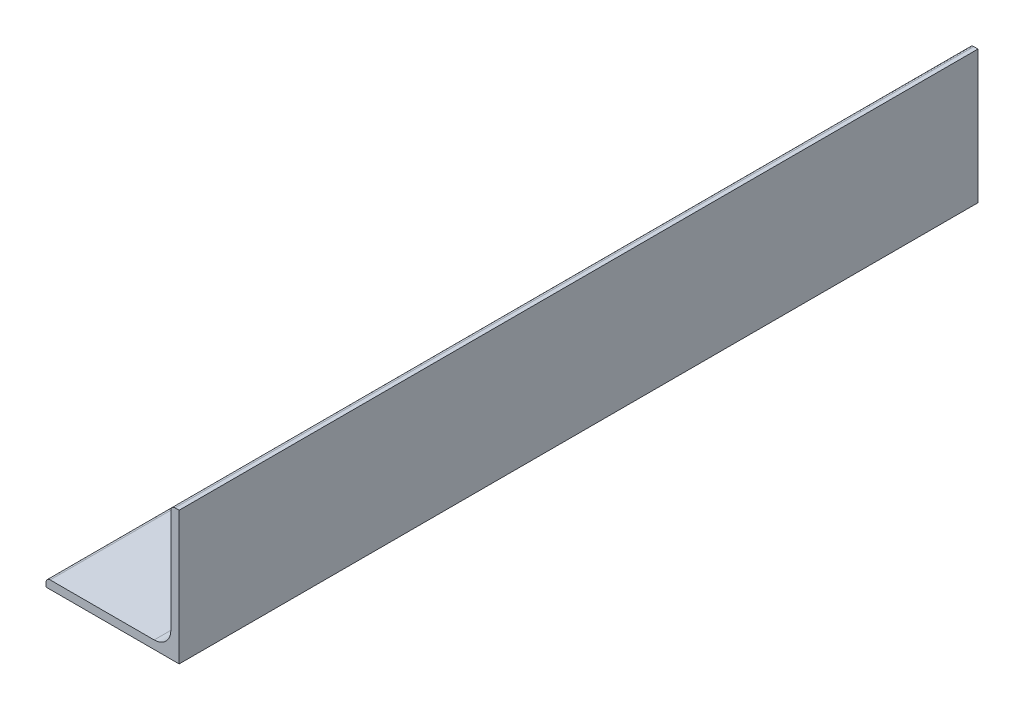
ISO-10303-21;
HEADER;
FILE_DESCRIPTION(('STEP AP214'),'2;1');
FILE_NAME('part.step','',(''),(''),'','','');
FILE_SCHEMA(('AUTOMOTIVE_DESIGN { 1 0 10303 214 1 1 1 1 }'));
ENDSEC;
DATA;
#1=APPLICATION_CONTEXT('core data for automotive mechanical design processes');
#2=APPLICATION_PROTOCOL_DEFINITION('international standard','automotive_design',2000,#1);
#3=PRODUCT_CONTEXT('',#1,'mechanical');
#4=PRODUCT('Part','Part','',(#3));
#5=PRODUCT_RELATED_PRODUCT_CATEGORY('part','',(#4));
#6=PRODUCT_DEFINITION_FORMATION('','',#4);
#7=PRODUCT_DEFINITION_CONTEXT('part definition',#1,'design');
#8=PRODUCT_DEFINITION('design','',#6,#7);
#9=PRODUCT_DEFINITION_SHAPE('','',#8);
#10=(LENGTH_UNIT() NAMED_UNIT(*) SI_UNIT(.MILLI.,.METRE.));
#11=(NAMED_UNIT(*) PLANE_ANGLE_UNIT() SI_UNIT($,.RADIAN.));
#12=(NAMED_UNIT(*) SI_UNIT($,.STERADIAN.) SOLID_ANGLE_UNIT());
#13=UNCERTAINTY_MEASURE_WITH_UNIT(LENGTH_MEASURE(1.E-05),#10,'distance_accuracy_value','');
#14=(GEOMETRIC_REPRESENTATION_CONTEXT(3) GLOBAL_UNCERTAINTY_ASSIGNED_CONTEXT((#13)) GLOBAL_UNIT_ASSIGNED_CONTEXT((#10,
#11,#12)) REPRESENTATION_CONTEXT('',''));
#15=CARTESIAN_POINT('',(0.,0.,0.));
#16=DIRECTION('',(0.,0.,1.));
#17=DIRECTION('',(1.,0.,0.));
#18=AXIS2_PLACEMENT_3D('',#15,#16,#17);
#19=CARTESIAN_POINT('',(-25.4,-23.8125,152.4));
#20=DIRECTION('',(1.,0.,0.));
#21=DIRECTION('',(0.,1.,0.));
#22=AXIS2_PLACEMENT_3D('',#19,#20,#21);
#23=PLANE('',#22);
#24=DIRECTION('',(0.,-1.,0.));
#25=VECTOR('',#24,1.);
#26=CARTESIAN_POINT('',(-25.4,-23.8125,-152.4));
#27=LINE('',#26,#25);
#28=CARTESIAN_POINT('',(-25.4,-23.8125,-152.4));
#29=VERTEX_POINT('',#28);
#30=CARTESIAN_POINT('',(-25.4,-25.4,-152.4));
#31=VERTEX_POINT('',#30);
#32=EDGE_CURVE('E136',#29,#31,#27,.T.);
#33=ORIENTED_EDGE('',*,*,#32,.T.);
#34=DIRECTION('',(0.,0.,-1.));
#35=VECTOR('',#34,1.);
#36=CARTESIAN_POINT('',(-25.4,-25.4,152.4));
#37=LINE('',#36,#35);
#38=CARTESIAN_POINT('',(-25.4,-25.4,152.4));
#39=VERTEX_POINT('',#38);
#40=EDGE_CURVE('E11',#39,#31,#37,.T.);
#41=ORIENTED_EDGE('',*,*,#40,.F.);
#42=DIRECTION('',(0.,-1.,0.));
#43=VECTOR('',#42,1.);
#44=CARTESIAN_POINT('',(-25.4,-23.8125,152.4));
#45=LINE('',#44,#43);
#46=CARTESIAN_POINT('',(-25.4,-23.8125,152.4));
#47=VERTEX_POINT('',#46);
#48=EDGE_CURVE('E152',#47,#39,#45,.T.);
#49=ORIENTED_EDGE('',*,*,#48,.F.);
#50=DIRECTION('',(0.,0.,-1.));
#51=VECTOR('',#50,1.);
#52=CARTESIAN_POINT('',(-25.4,-23.8125,152.4));
#53=LINE('',#52,#51);
#54=EDGE_CURVE('E132',#47,#29,#53,.T.);
#55=ORIENTED_EDGE('',*,*,#54,.T.);
#56=EDGE_LOOP('',(#33,#41,#49,#55));
#57=FACE_BOUND('',#56,.T.);
#58=ADVANCED_FACE('F34',(#57),#23,.F.);
#59=CARTESIAN_POINT('',(-25.4,-25.4,152.4));
#60=DIRECTION('',(0.,1.,0.));
#61=DIRECTION('',(-1.,0.,0.));
#62=AXIS2_PLACEMENT_3D('',#59,#60,#61);
#63=PLANE('',#62);
#64=DIRECTION('',(1.,0.,0.));
#65=VECTOR('',#64,1.);
#66=CARTESIAN_POINT('',(-25.4,-25.4,-152.4));
#67=LINE('',#66,#65);
#68=CARTESIAN_POINT('',(25.4,-25.4,-152.4));
#69=VERTEX_POINT('',#68);
#70=EDGE_CURVE('E139',#31,#69,#67,.T.);
#71=ORIENTED_EDGE('',*,*,#70,.T.);
#72=DIRECTION('',(0.,0.,-1.));
#73=VECTOR('',#72,1.);
#74=CARTESIAN_POINT('',(25.4,-25.4,152.4));
#75=LINE('',#74,#73);
#76=CARTESIAN_POINT('',(25.4,-25.4,152.4));
#77=VERTEX_POINT('',#76);
#78=EDGE_CURVE('E42',#77,#69,#75,.T.);
#79=ORIENTED_EDGE('',*,*,#78,.F.);
#80=DIRECTION('',(1.,0.,0.));
#81=VECTOR('',#80,1.);
#82=CARTESIAN_POINT('',(-25.4,-25.4,152.4));
#83=LINE('',#82,#81);
#84=EDGE_CURVE('E96',#39,#77,#83,.T.);
#85=ORIENTED_EDGE('',*,*,#84,.F.);
#86=ORIENTED_EDGE('',*,*,#40,.T.);
#87=EDGE_LOOP('',(#71,#79,#85,#86));
#88=FACE_BOUND('',#87,.T.);
#89=ADVANCED_FACE('F195',(#88),#63,.F.);
#90=CARTESIAN_POINT('',(25.4,-25.4,152.4));
#91=DIRECTION('',(-1.,0.,0.));
#92=DIRECTION('',(0.,-1.,0.));
#93=AXIS2_PLACEMENT_3D('',#90,#91,#92);
#94=PLANE('',#93);
#95=DIRECTION('',(0.,1.,0.));
#96=VECTOR('',#95,1.);
#97=CARTESIAN_POINT('',(25.4,-25.4,-152.4));
#98=LINE('',#97,#96);
#99=CARTESIAN_POINT('',(25.4,25.4,-152.4));
#100=VERTEX_POINT('',#99);
#101=EDGE_CURVE('E141',#69,#100,#98,.T.);
#102=ORIENTED_EDGE('',*,*,#101,.T.);
#103=DIRECTION('',(0.,0.,-1.));
#104=VECTOR('',#103,1.);
#105=CARTESIAN_POINT('',(25.4,25.4,152.4));
#106=LINE('',#105,#104);
#107=CARTESIAN_POINT('',(25.4,25.4,152.4));
#108=VERTEX_POINT('',#107);
#109=EDGE_CURVE('E162',#108,#100,#106,.T.);
#110=ORIENTED_EDGE('',*,*,#109,.F.);
#111=DIRECTION('',(0.,1.,0.));
#112=VECTOR('',#111,1.);
#113=CARTESIAN_POINT('',(25.4,-25.4,152.4));
#114=LINE('',#113,#112);
#115=EDGE_CURVE('E170',#77,#108,#114,.T.);
#116=ORIENTED_EDGE('',*,*,#115,.F.);
#117=ORIENTED_EDGE('',*,*,#78,.T.);
#118=EDGE_LOOP('',(#102,#110,#116,#117));
#119=FACE_BOUND('',#118,.T.);
#120=ADVANCED_FACE('F168',(#119),#94,.F.);
#121=CARTESIAN_POINT('',(23.8125,25.4,152.4));
#122=DIRECTION('',(0.,-1.,0.));
#123=DIRECTION('',(1.,0.,0.));
#124=AXIS2_PLACEMENT_3D('',#121,#122,#123);
#125=PLANE('',#124);
#126=DIRECTION('',(-1.,0.,0.));
#127=VECTOR('',#126,1.);
#128=CARTESIAN_POINT('',(23.8125,25.4,-152.4));
#129=LINE('',#128,#127);
#130=CARTESIAN_POINT('',(23.8125,25.4,-152.4));
#131=VERTEX_POINT('',#130);
#132=EDGE_CURVE('E143',#100,#131,#129,.T.);
#133=ORIENTED_EDGE('',*,*,#132,.T.);
#134=DIRECTION('',(0.,0.,-1.));
#135=VECTOR('',#134,1.);
#136=CARTESIAN_POINT('',(23.8125,25.4,152.4));
#137=LINE('',#136,#135);
#138=CARTESIAN_POINT('',(23.8125,25.4,152.4));
#139=VERTEX_POINT('',#138);
#140=EDGE_CURVE('E159',#139,#131,#137,.T.);
#141=ORIENTED_EDGE('',*,*,#140,.F.);
#142=DIRECTION('',(-1.,0.,0.));
#143=VECTOR('',#142,1.);
#144=CARTESIAN_POINT('',(23.8125,25.4,152.4));
#145=LINE('',#144,#143);
#146=EDGE_CURVE('E186',#108,#139,#145,.T.);
#147=ORIENTED_EDGE('',*,*,#146,.F.);
#148=ORIENTED_EDGE('',*,*,#109,.T.);
#149=EDGE_LOOP('',(#133,#141,#147,#148));
#150=FACE_BOUND('',#149,.T.);
#151=ADVANCED_FACE('F179',(#150),#125,.F.);
#152=CARTESIAN_POINT('',(23.8125,23.8125,152.4));
#153=DIRECTION('',(0.,0.,-1.));
#154=DIRECTION('',(-1.,0.,0.));
#155=AXIS2_PLACEMENT_3D('',#152,#153,#154);
#156=CYLINDRICAL_SURFACE('',#155,1.58750000000001);
#157=CARTESIAN_POINT('',(23.8125,23.8125,-152.4));
#158=DIRECTION('',(0.,0.,1.));
#159=DIRECTION('',(-1.,0.,0.));
#160=AXIS2_PLACEMENT_3D('',#157,#158,#159);
#161=CIRCLE('',#160,1.58750000000001);
#162=CARTESIAN_POINT('',(22.225,23.8125,-152.4));
#163=VERTEX_POINT('',#162);
#164=EDGE_CURVE('E145',#131,#163,#161,.T.);
#165=ORIENTED_EDGE('',*,*,#164,.T.);
#166=DIRECTION('',(0.,0.,-1.));
#167=VECTOR('',#166,1.);
#168=CARTESIAN_POINT('',(22.225,23.8125,152.4));
#169=LINE('',#168,#167);
#170=CARTESIAN_POINT('',(22.225,23.8125,152.4));
#171=VERTEX_POINT('',#170);
#172=EDGE_CURVE('E156',#171,#163,#169,.T.);
#173=ORIENTED_EDGE('',*,*,#172,.F.);
#174=CARTESIAN_POINT('',(23.8125,23.8125,152.4));
#175=DIRECTION('',(0.,0.,1.));
#176=DIRECTION('',(-1.,0.,0.));
#177=AXIS2_PLACEMENT_3D('',#174,#175,#176);
#178=CIRCLE('',#177,1.58750000000001);
#179=EDGE_CURVE('E185',#139,#171,#178,.T.);
#180=ORIENTED_EDGE('',*,*,#179,.F.);
#181=ORIENTED_EDGE('',*,*,#140,.T.);
#182=EDGE_LOOP('',(#165,#173,#180,#181));
#183=FACE_BOUND('',#182,.T.);
#184=ADVANCED_FACE('F183',(#183),#156,.T.);
#185=CARTESIAN_POINT('',(22.225,23.8125,152.4));
#186=DIRECTION('',(1.,0.,0.));
#187=DIRECTION('',(0.,1.,0.));
#188=AXIS2_PLACEMENT_3D('',#185,#186,#187);
#189=PLANE('',#188);
#190=DIRECTION('',(0.,-1.,0.));
#191=VECTOR('',#190,1.);
#192=CARTESIAN_POINT('',(22.225,23.8125,-152.4));
#193=LINE('',#192,#191);
#194=CARTESIAN_POINT('',(22.225,-15.875,-152.4));
#195=VERTEX_POINT('',#194);
#196=EDGE_CURVE('E147',#163,#195,#193,.T.);
#197=ORIENTED_EDGE('',*,*,#196,.T.);
#198=DIRECTION('',(0.,0.,-1.));
#199=VECTOR('',#198,1.);
#200=CARTESIAN_POINT('',(22.225,-15.875,152.4));
#201=LINE('',#200,#199);
#202=CARTESIAN_POINT('',(22.225,-15.875,152.4));
#203=VERTEX_POINT('',#202);
#204=EDGE_CURVE('E127',#203,#195,#201,.T.);
#205=ORIENTED_EDGE('',*,*,#204,.F.);
#206=DIRECTION('',(0.,-1.,0.));
#207=VECTOR('',#206,1.);
#208=CARTESIAN_POINT('',(22.225,23.8125,152.4));
#209=LINE('',#208,#207);
#210=EDGE_CURVE('E118',#171,#203,#209,.T.);
#211=ORIENTED_EDGE('',*,*,#210,.F.);
#212=ORIENTED_EDGE('',*,*,#172,.T.);
#213=EDGE_LOOP('',(#197,#205,#211,#212));
#214=FACE_BOUND('',#213,.T.);
#215=ADVANCED_FACE('F207',(#214),#189,.F.);
#216=CARTESIAN_POINT('',(15.875,-15.875,152.4));
#217=DIRECTION('',(0.,0.,-1.));
#218=DIRECTION('',(-1.,0.,0.));
#219=AXIS2_PLACEMENT_3D('',#216,#217,#218);
#220=CYLINDRICAL_SURFACE('',#219,6.35);
#221=CARTESIAN_POINT('',(15.875,-15.875,-152.4));
#222=DIRECTION('',(0.,0.,-1.));
#223=DIRECTION('',(-1.,0.,0.));
#224=AXIS2_PLACEMENT_3D('',#221,#222,#223);
#225=CIRCLE('',#224,6.35);
#226=CARTESIAN_POINT('',(15.875,-22.225,-152.4));
#227=VERTEX_POINT('',#226);
#228=EDGE_CURVE('E126',#195,#227,#225,.T.);
#229=ORIENTED_EDGE('',*,*,#228,.T.);
#230=DIRECTION('',(0.,0.,-1.));
#231=VECTOR('',#230,1.);
#232=CARTESIAN_POINT('',(15.875,-22.225,152.4));
#233=LINE('',#232,#231);
#234=CARTESIAN_POINT('',(15.875,-22.225,152.4));
#235=VERTEX_POINT('',#234);
#236=EDGE_CURVE('E123',#235,#227,#233,.T.);
#237=ORIENTED_EDGE('',*,*,#236,.F.);
#238=CARTESIAN_POINT('',(15.875,-15.875,152.4));
#239=DIRECTION('',(0.,0.,-1.));
#240=DIRECTION('',(-1.,0.,0.));
#241=AXIS2_PLACEMENT_3D('',#238,#239,#240);
#242=CIRCLE('',#241,6.35);
#243=EDGE_CURVE('E112',#203,#235,#242,.T.);
#244=ORIENTED_EDGE('',*,*,#243,.F.);
#245=ORIENTED_EDGE('',*,*,#204,.T.);
#246=EDGE_LOOP('',(#229,#237,#244,#245));
#247=FACE_BOUND('',#246,.T.);
#248=ADVANCED_FACE('F124',(#247),#220,.F.);
#249=CARTESIAN_POINT('',(15.875,-22.225,152.4));
#250=DIRECTION('',(0.,-1.,0.));
#251=DIRECTION('',(0.,0.,-1.));
#252=AXIS2_PLACEMENT_3D('',#249,#250,#251);
#253=PLANE('',#252);
#254=DIRECTION('',(-1.,0.,0.));
#255=VECTOR('',#254,1.);
#256=CARTESIAN_POINT('',(15.875,-22.225,-152.4));
#257=LINE('',#256,#255);
#258=CARTESIAN_POINT('',(-23.8125,-22.225,-152.4));
#259=VERTEX_POINT('',#258);
#260=EDGE_CURVE('E82',#227,#259,#257,.T.);
#261=ORIENTED_EDGE('',*,*,#260,.T.);
#262=DIRECTION('',(0.,0.,-1.));
#263=VECTOR('',#262,1.);
#264=CARTESIAN_POINT('',(-23.8125,-22.225,152.4));
#265=LINE('',#264,#263);
#266=CARTESIAN_POINT('',(-23.8125,-22.225,152.4));
#267=VERTEX_POINT('',#266);
#268=EDGE_CURVE('E128',#267,#259,#265,.T.);
#269=ORIENTED_EDGE('',*,*,#268,.F.);
#270=DIRECTION('',(-1.,0.,0.));
#271=VECTOR('',#270,1.);
#272=CARTESIAN_POINT('',(15.875,-22.225,152.4));
#273=LINE('',#272,#271);
#274=EDGE_CURVE('E116',#235,#267,#273,.T.);
#275=ORIENTED_EDGE('',*,*,#274,.F.);
#276=ORIENTED_EDGE('',*,*,#236,.T.);
#277=EDGE_LOOP('',(#261,#269,#275,#276));
#278=FACE_BOUND('',#277,.T.);
#279=ADVANCED_FACE('F130',(#278),#253,.F.);
#280=CARTESIAN_POINT('',(-23.8125,-23.8125,152.4));
#281=DIRECTION('',(0.,0.,-1.));
#282=DIRECTION('',(-1.,0.,0.));
#283=AXIS2_PLACEMENT_3D('',#280,#281,#282);
#284=CYLINDRICAL_SURFACE('',#283,1.5875);
#285=CARTESIAN_POINT('',(-23.8125,-23.8125,-152.4));
#286=DIRECTION('',(0.,0.,1.));
#287=DIRECTION('',(-1.,0.,0.));
#288=AXIS2_PLACEMENT_3D('',#285,#286,#287);
#289=CIRCLE('',#288,1.5875);
#290=EDGE_CURVE('E88',#259,#29,#289,.T.);
#291=ORIENTED_EDGE('',*,*,#290,.T.);
#292=ORIENTED_EDGE('',*,*,#54,.F.);
#293=CARTESIAN_POINT('',(-23.8125,-23.8125,152.4));
#294=DIRECTION('',(0.,0.,1.));
#295=DIRECTION('',(-1.,0.,0.));
#296=AXIS2_PLACEMENT_3D('',#293,#294,#295);
#297=CIRCLE('',#296,1.5875);
#298=EDGE_CURVE('E50',#267,#47,#297,.T.);
#299=ORIENTED_EDGE('',*,*,#298,.F.);
#300=ORIENTED_EDGE('',*,*,#268,.T.);
#301=EDGE_LOOP('',(#291,#292,#299,#300));
#302=FACE_BOUND('',#301,.T.);
#303=ADVANCED_FACE('F215',(#302),#284,.T.);
#304=CARTESIAN_POINT('',(23.8125,23.8125,152.4));
#305=DIRECTION('',(0.,0.,-1.));
#306=DIRECTION('',(-1.,0.,0.));
#307=AXIS2_PLACEMENT_3D('',#304,#305,#306);
#308=PLANE('',#307);
#309=ORIENTED_EDGE('',*,*,#48,.T.);
#310=ORIENTED_EDGE('',*,*,#84,.T.);
#311=ORIENTED_EDGE('',*,*,#115,.T.);
#312=ORIENTED_EDGE('',*,*,#146,.T.);
#313=ORIENTED_EDGE('',*,*,#179,.T.);
#314=ORIENTED_EDGE('',*,*,#210,.T.);
#315=ORIENTED_EDGE('',*,*,#243,.T.);
#316=ORIENTED_EDGE('',*,*,#274,.T.);
#317=ORIENTED_EDGE('',*,*,#298,.T.);
#318=EDGE_LOOP('',(#309,#310,#311,#312,#313,#314,#315,#316,#317));
#319=FACE_BOUND('',#318,.T.);
#320=ADVANCED_FACE('F114',(#319),#308,.F.);
#321=CARTESIAN_POINT('',(23.8125,23.8125,-152.4));
#322=DIRECTION('',(0.,0.,-1.));
#323=DIRECTION('',(-1.,0.,0.));
#324=AXIS2_PLACEMENT_3D('',#321,#322,#323);
#325=PLANE('',#324);
#326=ORIENTED_EDGE('',*,*,#32,.F.);
#327=ORIENTED_EDGE('',*,*,#290,.F.);
#328=ORIENTED_EDGE('',*,*,#260,.F.);
#329=ORIENTED_EDGE('',*,*,#228,.F.);
#330=ORIENTED_EDGE('',*,*,#196,.F.);
#331=ORIENTED_EDGE('',*,*,#164,.F.);
#332=ORIENTED_EDGE('',*,*,#132,.F.);
#333=ORIENTED_EDGE('',*,*,#101,.F.);
#334=ORIENTED_EDGE('',*,*,#70,.F.);
#335=EDGE_LOOP('',(#326,#327,#328,#329,#330,#331,#332,#333,#334));
#336=FACE_BOUND('',#335,.T.);
#337=ADVANCED_FACE('F174',(#336),#325,.T.);
#338=CLOSED_SHELL('',(#58,#89,#120,#151,#184,#215,#248,#279,#303,#320,#337));
#339=MANIFOLD_SOLID_BREP('B2',#338);
#340=ADVANCED_BREP_SHAPE_REPRESENTATION('',(#18,#339),#14);
#341=SHAPE_DEFINITION_REPRESENTATION(#9,#340);
ENDSEC;
END-ISO-10303-21;
